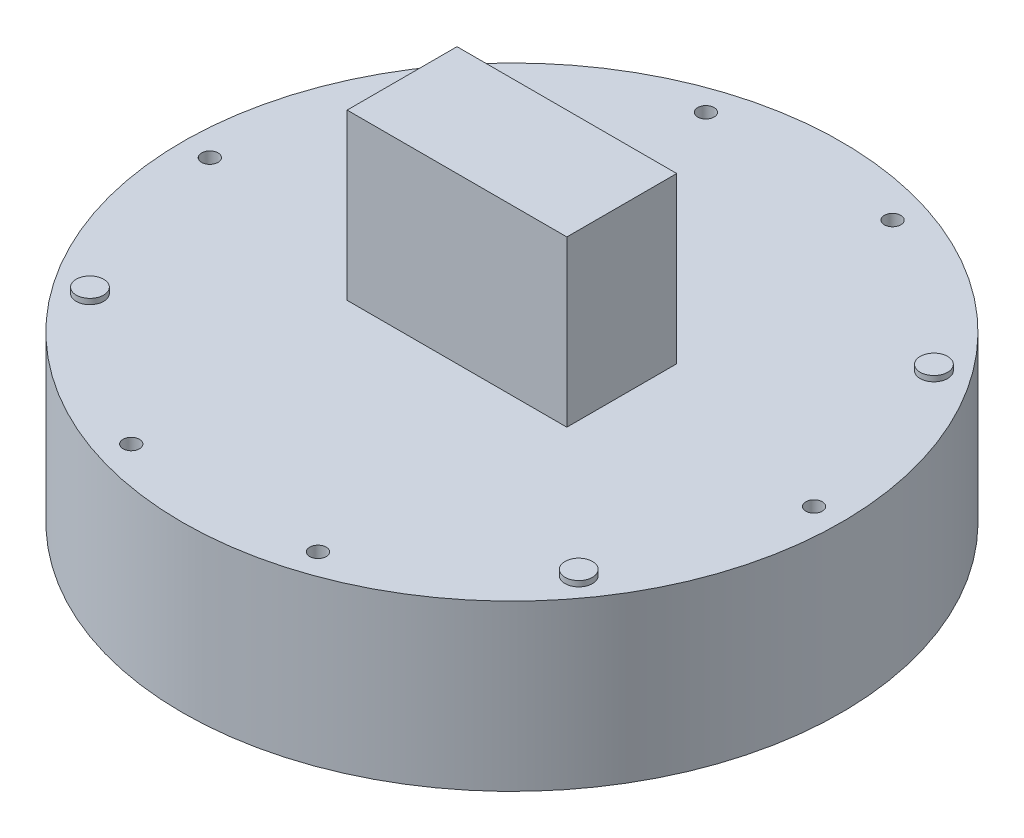
ISO-10303-21;
HEADER;
FILE_DESCRIPTION(('STEP AP214'),'2;1');
FILE_NAME('part.step','',(''),(''),'','','');
FILE_SCHEMA(('AUTOMOTIVE_DESIGN { 1 0 10303 214 1 1 1 1 }'));
ENDSEC;
DATA;
#1=APPLICATION_CONTEXT('core data for automotive mechanical design processes');
#2=APPLICATION_PROTOCOL_DEFINITION('international standard','automotive_design',2000,#1);
#3=PRODUCT_CONTEXT('',#1,'mechanical');
#4=PRODUCT('Part','Part','',(#3));
#5=PRODUCT_RELATED_PRODUCT_CATEGORY('part','',(#4));
#6=PRODUCT_DEFINITION_FORMATION('','',#4);
#7=PRODUCT_DEFINITION_CONTEXT('part definition',#1,'design');
#8=PRODUCT_DEFINITION('design','',#6,#7);
#9=PRODUCT_DEFINITION_SHAPE('','',#8);
#10=(LENGTH_UNIT() NAMED_UNIT(*) SI_UNIT(.MILLI.,.METRE.));
#11=(NAMED_UNIT(*) PLANE_ANGLE_UNIT() SI_UNIT($,.RADIAN.));
#12=(NAMED_UNIT(*) SI_UNIT($,.STERADIAN.) SOLID_ANGLE_UNIT());
#13=UNCERTAINTY_MEASURE_WITH_UNIT(LENGTH_MEASURE(1.E-05),#10,'distance_accuracy_value','');
#14=(GEOMETRIC_REPRESENTATION_CONTEXT(3) GLOBAL_UNCERTAINTY_ASSIGNED_CONTEXT((#13)) GLOBAL_UNIT_ASSIGNED_CONTEXT((#10,
#11,#12)) REPRESENTATION_CONTEXT('',''));
#15=CARTESIAN_POINT('',(0.,0.,0.));
#16=DIRECTION('',(0.,0.,1.));
#17=DIRECTION('',(1.,0.,0.));
#18=AXIS2_PLACEMENT_3D('',#15,#16,#17);
#19=CARTESIAN_POINT('',(0.,30.,0.));
#20=DIRECTION('',(0.,1.,0.));
#21=DIRECTION('',(0.,0.,1.));
#22=AXIS2_PLACEMENT_3D('',#19,#20,#21);
#23=PLANE('',#22);
#24=CARTESIAN_POINT('',(44.4959346906225,30.,32.3281888760854));
#25=DIRECTION('',(0.,1.,0.));
#26=DIRECTION('',(0.,0.,1.));
#27=AXIS2_PLACEMENT_3D('',#24,#25,#26);
#28=CIRCLE('',#27,2.5);
#29=CARTESIAN_POINT('',(44.4959346906225,30.,34.8281888760854));
#30=VERTEX_POINT('',#29);
#31=EDGE_CURVE('E299',#30,#30,#28,.T.);
#32=ORIENTED_EDGE('',*,*,#31,.F.);
#33=EDGE_LOOP('',(#32));
#34=FACE_BOUND('',#33,.T.);
#35=CARTESIAN_POINT('',(-44.4959346906218,30.,32.3281888760864));
#36=DIRECTION('',(0.,1.,0.));
#37=DIRECTION('',(0.,0.,1.));
#38=AXIS2_PLACEMENT_3D('',#35,#36,#37);
#39=CIRCLE('',#38,2.5);
#40=CARTESIAN_POINT('',(-44.4959346906218,30.,34.8281888760864));
#41=VERTEX_POINT('',#40);
#42=EDGE_CURVE('E310',#41,#41,#39,.T.);
#43=ORIENTED_EDGE('',*,*,#42,.F.);
#44=EDGE_LOOP('',(#43));
#45=FACE_BOUND('',#44,.T.);
#46=CARTESIAN_POINT('',(44.4959346906221,30.,-32.3281888760861));
#47=DIRECTION('',(0.,1.,0.));
#48=DIRECTION('',(0.,0.,1.));
#49=AXIS2_PLACEMENT_3D('',#46,#47,#48);
#50=CIRCLE('',#49,2.5);
#51=CARTESIAN_POINT('',(44.4959346906221,30.,-29.8281888760861));
#52=VERTEX_POINT('',#51);
#53=EDGE_CURVE('E319',#52,#52,#50,.T.);
#54=ORIENTED_EDGE('',*,*,#53,.F.);
#55=EDGE_LOOP('',(#54));
#56=FACE_BOUND('',#55,.T.);
#57=CARTESIAN_POINT('',(-44.4959346906223,30.,-32.3281888760858));
#58=DIRECTION('',(0.,1.,0.));
#59=DIRECTION('',(0.,0.,1.));
#60=AXIS2_PLACEMENT_3D('',#57,#58,#59);
#61=CIRCLE('',#60,2.5);
#62=CARTESIAN_POINT('',(-44.4959346906223,30.,-29.8281888760858));
#63=VERTEX_POINT('',#62);
#64=EDGE_CURVE('E328',#63,#63,#61,.T.);
#65=ORIENTED_EDGE('',*,*,#64,.F.);
#66=EDGE_LOOP('',(#65));
#67=FACE_BOUND('',#66,.T.);
#68=CARTESIAN_POINT('',(16.9959346906227,30.,52.3081083962333));
#69=DIRECTION('',(0.,1.,0.));
#70=DIRECTION('',(-0.95105651629515,0.,0.309016994374958));
#71=AXIS2_PLACEMENT_3D('',#68,#69,#70);
#72=CIRCLE('',#71,1.5);
#73=CARTESIAN_POINT('',(15.56934991618,30.,52.7716338877957));
#74=VERTEX_POINT('',#73);
#75=EDGE_CURVE('E149',#74,#74,#72,.T.);
#76=ORIENTED_EDGE('',*,*,#75,.F.);
#77=EDGE_LOOP('',(#76));
#78=FACE_BOUND('',#77,.T.);
#79=CARTESIAN_POINT('',(-16.9959346906216,30.,52.3081083962336));
#80=DIRECTION('',(0.,1.,0.));
#81=DIRECTION('',(-0.951056516295157,0.,-0.309016994374938));
#82=AXIS2_PLACEMENT_3D('',#79,#80,#81);
#83=CIRCLE('',#82,1.5);
#84=CARTESIAN_POINT('',(-18.4225194650643,30.,51.8445829046712));
#85=VERTEX_POINT('',#84);
#86=EDGE_CURVE('E143',#85,#85,#83,.T.);
#87=ORIENTED_EDGE('',*,*,#86,.F.);
#88=EDGE_LOOP('',(#87));
#89=FACE_BOUND('',#88,.T.);
#90=CARTESIAN_POINT('',(-55.,30.,0.));
#91=DIRECTION('',(0.,1.,0.));
#92=DIRECTION('',(0.,0.,-1.));
#93=AXIS2_PLACEMENT_3D('',#90,#91,#92);
#94=CIRCLE('',#93,1.5);
#95=CARTESIAN_POINT('',(-55.,30.,-1.5));
#96=VERTEX_POINT('',#95);
#97=EDGE_CURVE('E134',#96,#96,#94,.T.);
#98=ORIENTED_EDGE('',*,*,#97,.F.);
#99=EDGE_LOOP('',(#98));
#100=FACE_BOUND('',#99,.T.);
#101=CARTESIAN_POINT('',(-16.9959346906223,30.,-52.3081083962334));
#102=DIRECTION('',(0.,1.,0.));
#103=DIRECTION('',(0.951056516295152,0.,-0.309016994374952));
#104=AXIS2_PLACEMENT_3D('',#101,#102,#103);
#105=CIRCLE('',#104,1.5);
#106=CARTESIAN_POINT('',(-15.5693499161796,30.,-52.7716338877958));
#107=VERTEX_POINT('',#106);
#108=EDGE_CURVE('E125',#107,#107,#105,.T.);
#109=ORIENTED_EDGE('',*,*,#108,.F.);
#110=EDGE_LOOP('',(#109));
#111=FACE_BOUND('',#110,.T.);
#112=CARTESIAN_POINT('',(16.995934690622,30.,-52.3081083962335));
#113=DIRECTION('',(0.,1.,0.));
#114=DIRECTION('',(0.951056516295155,0.,0.309016994374945));
#115=AXIS2_PLACEMENT_3D('',#112,#113,#114);
#116=CIRCLE('',#115,1.5);
#117=CARTESIAN_POINT('',(18.4225194650647,30.,-51.8445829046711));
#118=VERTEX_POINT('',#117);
#119=EDGE_CURVE('E119',#118,#118,#116,.T.);
#120=ORIENTED_EDGE('',*,*,#119,.F.);
#121=EDGE_LOOP('',(#120));
#122=FACE_BOUND('',#121,.T.);
#123=CARTESIAN_POINT('',(55.,30.,0.));
#124=DIRECTION('',(0.,1.,0.));
#125=DIRECTION('',(0.,0.,1.));
#126=AXIS2_PLACEMENT_3D('',#123,#124,#125);
#127=CIRCLE('',#126,1.5);
#128=CARTESIAN_POINT('',(55.,30.,1.5));
#129=VERTEX_POINT('',#128);
#130=EDGE_CURVE('E156',#129,#129,#127,.T.);
#131=ORIENTED_EDGE('',*,*,#130,.F.);
#132=EDGE_LOOP('',(#131));
#133=FACE_BOUND('',#132,.T.);
#134=CARTESIAN_POINT('',(0.,30.,0.));
#135=DIRECTION('',(0.,1.,0.));
#136=DIRECTION('',(0.,0.,1.));
#137=AXIS2_PLACEMENT_3D('',#134,#135,#136);
#138=CIRCLE('',#137,60.);
#139=CARTESIAN_POINT('',(0.,30.,60.));
#140=VERTEX_POINT('',#139);
#141=EDGE_CURVE('E11',#140,#140,#138,.T.);
#142=ORIENTED_EDGE('',*,*,#141,.T.);
#143=EDGE_LOOP('',(#142));
#144=FACE_BOUND('',#143,.T.);
#145=DIRECTION('',(-1.,0.,0.));
#146=VECTOR('',#145,1.);
#147=CARTESIAN_POINT('',(-20.,30.,-10.));
#148=LINE('',#147,#146);
#149=CARTESIAN_POINT('',(20.,30.,-10.));
#150=VERTEX_POINT('',#149);
#151=CARTESIAN_POINT('',(-20.,30.,-10.));
#152=VERTEX_POINT('',#151);
#153=EDGE_CURVE('E92',#150,#152,#148,.T.);
#154=ORIENTED_EDGE('',*,*,#153,.F.);
#155=DIRECTION('',(0.,0.,-1.));
#156=VECTOR('',#155,1.);
#157=CARTESIAN_POINT('',(20.,30.,-10.));
#158=LINE('',#157,#156);
#159=CARTESIAN_POINT('',(20.,30.,10.));
#160=VERTEX_POINT('',#159);
#161=EDGE_CURVE('E103',#160,#150,#158,.T.);
#162=ORIENTED_EDGE('',*,*,#161,.F.);
#163=DIRECTION('',(1.,0.,0.));
#164=VECTOR('',#163,1.);
#165=CARTESIAN_POINT('',(-20.,30.,10.));
#166=LINE('',#165,#164);
#167=CARTESIAN_POINT('',(-20.,30.,10.));
#168=VERTEX_POINT('',#167);
#169=EDGE_CURVE('E73',#168,#160,#166,.T.);
#170=ORIENTED_EDGE('',*,*,#169,.F.);
#171=DIRECTION('',(0.,0.,1.));
#172=VECTOR('',#171,1.);
#173=CARTESIAN_POINT('',(-20.,30.,-10.));
#174=LINE('',#173,#172);
#175=EDGE_CURVE('E108',#152,#168,#174,.T.);
#176=ORIENTED_EDGE('',*,*,#175,.F.);
#177=EDGE_LOOP('',(#154,#162,#170,#176));
#178=FACE_BOUND('',#177,.T.);
#179=ADVANCED_FACE('F35',(#34,#45,#56,#67,#78,#89,#100,#111,#122,#133,#144,#178),#23,.T.);
#180=CARTESIAN_POINT('',(0.,30.,0.));
#181=DIRECTION('',(0.,-1.,0.));
#182=DIRECTION('',(0.,0.,-1.));
#183=AXIS2_PLACEMENT_3D('',#180,#181,#182);
#184=CYLINDRICAL_SURFACE('',#183,60.);
#185=ORIENTED_EDGE('',*,*,#141,.F.);
#186=EDGE_LOOP('',(#185));
#187=FACE_BOUND('',#186,.T.);
#188=CARTESIAN_POINT('',(0.,0.,0.));
#189=DIRECTION('',(0.,1.,0.));
#190=DIRECTION('',(0.,0.,1.));
#191=AXIS2_PLACEMENT_3D('',#188,#189,#190);
#192=CIRCLE('',#191,60.);
#193=CARTESIAN_POINT('',(0.,0.,60.));
#194=VERTEX_POINT('',#193);
#195=EDGE_CURVE('E39',#194,#194,#192,.T.);
#196=ORIENTED_EDGE('',*,*,#195,.T.);
#197=EDGE_LOOP('',(#196));
#198=FACE_BOUND('',#197,.T.);
#199=ADVANCED_FACE('F37',(#187,#198),#184,.T.);
#200=CARTESIAN_POINT('',(0.,0.,0.));
#201=DIRECTION('',(0.,1.,0.));
#202=DIRECTION('',(0.,0.,1.));
#203=AXIS2_PLACEMENT_3D('',#200,#201,#202);
#204=PLANE('',#203);
#205=CARTESIAN_POINT('',(0.,0.,0.));
#206=DIRECTION('',(0.,-1.,0.));
#207=DIRECTION('',(0.,0.,-1.));
#208=AXIS2_PLACEMENT_3D('',#205,#206,#207);
#209=CIRCLE('',#208,2.5);
#210=CARTESIAN_POINT('',(0.,0.,-2.5));
#211=VERTEX_POINT('',#210);
#212=EDGE_CURVE('E291',#211,#211,#209,.T.);
#213=ORIENTED_EDGE('',*,*,#212,.F.);
#214=EDGE_LOOP('',(#213));
#215=FACE_BOUND('',#214,.T.);
#216=ORIENTED_EDGE('',*,*,#195,.F.);
#217=EDGE_LOOP('',(#216));
#218=FACE_BOUND('',#217,.T.);
#219=ADVANCED_FACE('F278',(#215,#218),#204,.F.);
#220=CARTESIAN_POINT('',(55.,25.,0.));
#221=DIRECTION('',(0.,1.,0.));
#222=DIRECTION('',(0.,0.,1.));
#223=AXIS2_PLACEMENT_3D('',#220,#221,#222);
#224=CYLINDRICAL_SURFACE('',#223,1.5);
#225=CARTESIAN_POINT('',(55.,25.,0.));
#226=DIRECTION('',(0.,1.,0.));
#227=DIRECTION('',(0.,0.,1.));
#228=AXIS2_PLACEMENT_3D('',#225,#226,#227);
#229=CIRCLE('',#228,1.5);
#230=CARTESIAN_POINT('',(55.,25.,1.5));
#231=VERTEX_POINT('',#230);
#232=EDGE_CURVE('E157',#231,#231,#229,.T.);
#233=ORIENTED_EDGE('',*,*,#232,.F.);
#234=EDGE_LOOP('',(#233));
#235=FACE_BOUND('',#234,.T.);
#236=ORIENTED_EDGE('',*,*,#130,.T.);
#237=EDGE_LOOP('',(#236));
#238=FACE_BOUND('',#237,.T.);
#239=ADVANCED_FACE('F163',(#235,#238),#224,.F.);
#240=CARTESIAN_POINT('',(55.,25.,0.));
#241=DIRECTION('',(0.,1.,0.));
#242=DIRECTION('',(0.,0.,1.));
#243=AXIS2_PLACEMENT_3D('',#240,#241,#242);
#244=PLANE('',#243);
#245=ORIENTED_EDGE('',*,*,#232,.T.);
#246=EDGE_LOOP('',(#245));
#247=FACE_BOUND('',#246,.T.);
#248=ADVANCED_FACE('F199',(#247),#244,.T.);
#249=CARTESIAN_POINT('',(16.995934690622,25.,-52.3081083962335));
#250=DIRECTION('',(0.,1.,0.));
#251=DIRECTION('',(0.,0.,1.));
#252=AXIS2_PLACEMENT_3D('',#249,#250,#251);
#253=CYLINDRICAL_SURFACE('',#252,1.5);
#254=CARTESIAN_POINT('',(16.995934690622,25.,-52.3081083962335));
#255=DIRECTION('',(0.,1.,0.));
#256=DIRECTION('',(0.951056516295155,0.,0.309016994374945));
#257=AXIS2_PLACEMENT_3D('',#254,#255,#256);
#258=CIRCLE('',#257,1.5);
#259=CARTESIAN_POINT('',(18.4225194650647,25.,-51.8445829046711));
#260=VERTEX_POINT('',#259);
#261=EDGE_CURVE('E115',#260,#260,#258,.T.);
#262=ORIENTED_EDGE('',*,*,#261,.F.);
#263=EDGE_LOOP('',(#262));
#264=FACE_BOUND('',#263,.T.);
#265=ORIENTED_EDGE('',*,*,#119,.T.);
#266=EDGE_LOOP('',(#265));
#267=FACE_BOUND('',#266,.T.);
#268=ADVANCED_FACE('F195',(#264,#267),#253,.F.);
#269=CARTESIAN_POINT('',(16.995934690622,25.,-52.3081083962335));
#270=DIRECTION('',(0.,1.,0.));
#271=DIRECTION('',(0.951056516295155,0.,0.309016994374945));
#272=AXIS2_PLACEMENT_3D('',#269,#270,#271);
#273=PLANE('',#272);
#274=ORIENTED_EDGE('',*,*,#261,.T.);
#275=EDGE_LOOP('',(#274));
#276=FACE_BOUND('',#275,.T.);
#277=ADVANCED_FACE('F191',(#276),#273,.T.);
#278=CARTESIAN_POINT('',(-16.9959346906223,25.,-52.3081083962334));
#279=DIRECTION('',(0.,1.,0.));
#280=DIRECTION('',(0.,0.,1.));
#281=AXIS2_PLACEMENT_3D('',#278,#279,#280);
#282=CYLINDRICAL_SURFACE('',#281,1.5);
#283=CARTESIAN_POINT('',(-16.9959346906223,25.,-52.3081083962334));
#284=DIRECTION('',(0.,1.,0.));
#285=DIRECTION('',(0.951056516295152,0.,-0.309016994374952));
#286=AXIS2_PLACEMENT_3D('',#283,#284,#285);
#287=CIRCLE('',#286,1.5);
#288=CARTESIAN_POINT('',(-15.5693499161796,25.,-52.7716338877958));
#289=VERTEX_POINT('',#288);
#290=EDGE_CURVE('E122',#289,#289,#287,.T.);
#291=ORIENTED_EDGE('',*,*,#290,.F.);
#292=EDGE_LOOP('',(#291));
#293=FACE_BOUND('',#292,.T.);
#294=ORIENTED_EDGE('',*,*,#108,.T.);
#295=EDGE_LOOP('',(#294));
#296=FACE_BOUND('',#295,.T.);
#297=ADVANCED_FACE('F194',(#293,#296),#282,.F.);
#298=CARTESIAN_POINT('',(-16.9959346906223,25.,-52.3081083962334));
#299=DIRECTION('',(0.,1.,0.));
#300=DIRECTION('',(0.951056516295152,0.,-0.309016994374952));
#301=AXIS2_PLACEMENT_3D('',#298,#299,#300);
#302=PLANE('',#301);
#303=ORIENTED_EDGE('',*,*,#290,.T.);
#304=EDGE_LOOP('',(#303));
#305=FACE_BOUND('',#304,.T.);
#306=ADVANCED_FACE('F201',(#305),#302,.T.);
#307=CARTESIAN_POINT('',(-55.,25.,0.));
#308=DIRECTION('',(0.,1.,0.));
#309=DIRECTION('',(0.,0.,1.));
#310=AXIS2_PLACEMENT_3D('',#307,#308,#309);
#311=CYLINDRICAL_SURFACE('',#310,1.5);
#312=CARTESIAN_POINT('',(-55.,25.,0.));
#313=DIRECTION('',(0.,1.,0.));
#314=DIRECTION('',(0.,0.,-1.));
#315=AXIS2_PLACEMENT_3D('',#312,#313,#314);
#316=CIRCLE('',#315,1.5);
#317=CARTESIAN_POINT('',(-55.,25.,-1.5));
#318=VERTEX_POINT('',#317);
#319=EDGE_CURVE('E131',#318,#318,#316,.T.);
#320=ORIENTED_EDGE('',*,*,#319,.F.);
#321=EDGE_LOOP('',(#320));
#322=FACE_BOUND('',#321,.T.);
#323=ORIENTED_EDGE('',*,*,#97,.T.);
#324=EDGE_LOOP('',(#323));
#325=FACE_BOUND('',#324,.T.);
#326=ADVANCED_FACE('F204',(#322,#325),#311,.F.);
#327=CARTESIAN_POINT('',(-55.,25.,0.));
#328=DIRECTION('',(0.,1.,0.));
#329=DIRECTION('',(0.,0.,-1.));
#330=AXIS2_PLACEMENT_3D('',#327,#328,#329);
#331=PLANE('',#330);
#332=ORIENTED_EDGE('',*,*,#319,.T.);
#333=EDGE_LOOP('',(#332));
#334=FACE_BOUND('',#333,.T.);
#335=ADVANCED_FACE('F220',(#334),#331,.T.);
#336=CARTESIAN_POINT('',(-16.9959346906216,25.,52.3081083962336));
#337=DIRECTION('',(0.,1.,0.));
#338=DIRECTION('',(0.,0.,1.));
#339=AXIS2_PLACEMENT_3D('',#336,#337,#338);
#340=CYLINDRICAL_SURFACE('',#339,1.5);
#341=CARTESIAN_POINT('',(-16.9959346906216,25.,52.3081083962336));
#342=DIRECTION('',(0.,1.,0.));
#343=DIRECTION('',(-0.951056516295157,0.,-0.309016994374938));
#344=AXIS2_PLACEMENT_3D('',#341,#342,#343);
#345=CIRCLE('',#344,1.5);
#346=CARTESIAN_POINT('',(-18.4225194650643,25.,51.8445829046712));
#347=VERTEX_POINT('',#346);
#348=EDGE_CURVE('E140',#347,#347,#345,.T.);
#349=ORIENTED_EDGE('',*,*,#348,.F.);
#350=EDGE_LOOP('',(#349));
#351=FACE_BOUND('',#350,.T.);
#352=ORIENTED_EDGE('',*,*,#86,.T.);
#353=EDGE_LOOP('',(#352));
#354=FACE_BOUND('',#353,.T.);
#355=ADVANCED_FACE('F223',(#351,#354),#340,.F.);
#356=CARTESIAN_POINT('',(-16.9959346906216,25.,52.3081083962336));
#357=DIRECTION('',(0.,1.,0.));
#358=DIRECTION('',(-0.951056516295157,0.,-0.309016994374938));
#359=AXIS2_PLACEMENT_3D('',#356,#357,#358);
#360=PLANE('',#359);
#361=ORIENTED_EDGE('',*,*,#348,.T.);
#362=EDGE_LOOP('',(#361));
#363=FACE_BOUND('',#362,.T.);
#364=ADVANCED_FACE('F239',(#363),#360,.T.);
#365=CARTESIAN_POINT('',(16.9959346906227,25.,52.3081083962333));
#366=DIRECTION('',(0.,1.,0.));
#367=DIRECTION('',(0.,0.,1.));
#368=AXIS2_PLACEMENT_3D('',#365,#366,#367);
#369=CYLINDRICAL_SURFACE('',#368,1.5);
#370=CARTESIAN_POINT('',(16.9959346906227,25.,52.3081083962333));
#371=DIRECTION('',(0.,1.,0.));
#372=DIRECTION('',(-0.95105651629515,0.,0.309016994374958));
#373=AXIS2_PLACEMENT_3D('',#370,#371,#372);
#374=CIRCLE('',#373,1.5);
#375=CARTESIAN_POINT('',(15.56934991618,25.,52.7716338877957));
#376=VERTEX_POINT('',#375);
#377=EDGE_CURVE('E146',#376,#376,#374,.T.);
#378=ORIENTED_EDGE('',*,*,#377,.F.);
#379=EDGE_LOOP('',(#378));
#380=FACE_BOUND('',#379,.T.);
#381=ORIENTED_EDGE('',*,*,#75,.T.);
#382=EDGE_LOOP('',(#381));
#383=FACE_BOUND('',#382,.T.);
#384=ADVANCED_FACE('F242',(#380,#383),#369,.F.);
#385=CARTESIAN_POINT('',(16.9959346906227,25.,52.3081083962333));
#386=DIRECTION('',(0.,1.,0.));
#387=DIRECTION('',(-0.95105651629515,0.,0.309016994374958));
#388=AXIS2_PLACEMENT_3D('',#385,#386,#387);
#389=PLANE('',#388);
#390=ORIENTED_EDGE('',*,*,#377,.T.);
#391=EDGE_LOOP('',(#390));
#392=FACE_BOUND('',#391,.T.);
#393=ADVANCED_FACE('F190',(#392),#389,.T.);
#394=CARTESIAN_POINT('',(20.,60.,-10.));
#395=DIRECTION('',(-1.,0.,0.));
#396=DIRECTION('',(0.,0.,1.));
#397=AXIS2_PLACEMENT_3D('',#394,#395,#396);
#398=PLANE('',#397);
#399=ORIENTED_EDGE('',*,*,#161,.T.);
#400=DIRECTION('',(0.,-1.,0.));
#401=VECTOR('',#400,1.);
#402=CARTESIAN_POINT('',(20.,60.,-10.));
#403=LINE('',#402,#401);
#404=CARTESIAN_POINT('',(20.,60.,-10.));
#405=VERTEX_POINT('',#404);
#406=EDGE_CURVE('E95',#405,#150,#403,.T.);
#407=ORIENTED_EDGE('',*,*,#406,.F.);
#408=DIRECTION('',(0.,0.,-1.));
#409=VECTOR('',#408,1.);
#410=CARTESIAN_POINT('',(20.,60.,-10.));
#411=LINE('',#410,#409);
#412=CARTESIAN_POINT('',(20.,60.,10.));
#413=VERTEX_POINT('',#412);
#414=EDGE_CURVE('E85',#413,#405,#411,.T.);
#415=ORIENTED_EDGE('',*,*,#414,.F.);
#416=DIRECTION('',(0.,-1.,0.));
#417=VECTOR('',#416,1.);
#418=CARTESIAN_POINT('',(20.,60.,10.));
#419=LINE('',#418,#417);
#420=EDGE_CURVE('E99',#413,#160,#419,.T.);
#421=ORIENTED_EDGE('',*,*,#420,.T.);
#422=EDGE_LOOP('',(#399,#407,#415,#421));
#423=FACE_BOUND('',#422,.T.);
#424=ADVANCED_FACE('F173',(#423),#398,.F.);
#425=CARTESIAN_POINT('',(-20.,60.,-10.));
#426=DIRECTION('',(0.,0.,1.));
#427=DIRECTION('',(1.,0.,0.));
#428=AXIS2_PLACEMENT_3D('',#425,#426,#427);
#429=PLANE('',#428);
#430=ORIENTED_EDGE('',*,*,#153,.T.);
#431=DIRECTION('',(0.,-1.,0.));
#432=VECTOR('',#431,1.);
#433=CARTESIAN_POINT('',(-20.,60.,-10.));
#434=LINE('',#433,#432);
#435=CARTESIAN_POINT('',(-20.,60.,-10.));
#436=VERTEX_POINT('',#435);
#437=EDGE_CURVE('E89',#436,#152,#434,.T.);
#438=ORIENTED_EDGE('',*,*,#437,.F.);
#439=DIRECTION('',(-1.,0.,0.));
#440=VECTOR('',#439,1.);
#441=CARTESIAN_POINT('',(-20.,60.,-10.));
#442=LINE('',#441,#440);
#443=EDGE_CURVE('E80',#405,#436,#442,.T.);
#444=ORIENTED_EDGE('',*,*,#443,.F.);
#445=ORIENTED_EDGE('',*,*,#406,.T.);
#446=EDGE_LOOP('',(#430,#438,#444,#445));
#447=FACE_BOUND('',#446,.T.);
#448=ADVANCED_FACE('F90',(#447),#429,.F.);
#449=CARTESIAN_POINT('',(-20.,60.,-10.));
#450=DIRECTION('',(1.,0.,0.));
#451=DIRECTION('',(0.,0.,-1.));
#452=AXIS2_PLACEMENT_3D('',#449,#450,#451);
#453=PLANE('',#452);
#454=ORIENTED_EDGE('',*,*,#175,.T.);
#455=DIRECTION('',(0.,-1.,0.));
#456=VECTOR('',#455,1.);
#457=CARTESIAN_POINT('',(-20.,60.,10.));
#458=LINE('',#457,#456);
#459=CARTESIAN_POINT('',(-20.,60.,10.));
#460=VERTEX_POINT('',#459);
#461=EDGE_CURVE('E51',#460,#168,#458,.T.);
#462=ORIENTED_EDGE('',*,*,#461,.F.);
#463=DIRECTION('',(0.,0.,1.));
#464=VECTOR('',#463,1.);
#465=CARTESIAN_POINT('',(-20.,60.,-10.));
#466=LINE('',#465,#464);
#467=EDGE_CURVE('E83',#436,#460,#466,.T.);
#468=ORIENTED_EDGE('',*,*,#467,.F.);
#469=ORIENTED_EDGE('',*,*,#437,.T.);
#470=EDGE_LOOP('',(#454,#462,#468,#469));
#471=FACE_BOUND('',#470,.T.);
#472=ADVANCED_FACE('F97',(#471),#453,.F.);
#473=CARTESIAN_POINT('',(-20.,60.,10.));
#474=DIRECTION('',(0.,0.,-1.));
#475=DIRECTION('',(-1.,0.,0.));
#476=AXIS2_PLACEMENT_3D('',#473,#474,#475);
#477=PLANE('',#476);
#478=ORIENTED_EDGE('',*,*,#169,.T.);
#479=ORIENTED_EDGE('',*,*,#420,.F.);
#480=DIRECTION('',(1.,0.,0.));
#481=VECTOR('',#480,1.);
#482=CARTESIAN_POINT('',(-20.,60.,10.));
#483=LINE('',#482,#481);
#484=EDGE_CURVE('E59',#460,#413,#483,.T.);
#485=ORIENTED_EDGE('',*,*,#484,.F.);
#486=ORIENTED_EDGE('',*,*,#461,.T.);
#487=EDGE_LOOP('',(#478,#479,#485,#486));
#488=FACE_BOUND('',#487,.T.);
#489=ADVANCED_FACE('F174',(#488),#477,.F.);
#490=CARTESIAN_POINT('',(0.,60.,0.));
#491=DIRECTION('',(0.,1.,0.));
#492=DIRECTION('',(0.,0.,1.));
#493=AXIS2_PLACEMENT_3D('',#490,#491,#492);
#494=PLANE('',#493);
#495=ORIENTED_EDGE('',*,*,#414,.T.);
#496=ORIENTED_EDGE('',*,*,#443,.T.);
#497=ORIENTED_EDGE('',*,*,#467,.T.);
#498=ORIENTED_EDGE('',*,*,#484,.T.);
#499=EDGE_LOOP('',(#495,#496,#497,#498));
#500=FACE_BOUND('',#499,.T.);
#501=ADVANCED_FACE('F81',(#500),#494,.T.);
#502=CARTESIAN_POINT('',(-44.4959346906223,31.,-32.3281888760858));
#503=DIRECTION('',(0.,-1.,0.));
#504=DIRECTION('',(0.,0.,-1.));
#505=AXIS2_PLACEMENT_3D('',#502,#503,#504);
#506=CYLINDRICAL_SURFACE('',#505,2.5);
#507=CARTESIAN_POINT('',(-44.4959346906223,31.,-32.3281888760858));
#508=DIRECTION('',(0.,1.,0.));
#509=DIRECTION('',(0.,0.,1.));
#510=AXIS2_PLACEMENT_3D('',#507,#508,#509);
#511=CIRCLE('',#510,2.5);
#512=CARTESIAN_POINT('',(-44.4959346906223,31.,-29.8281888760858));
#513=VERTEX_POINT('',#512);
#514=EDGE_CURVE('E329',#513,#513,#511,.T.);
#515=ORIENTED_EDGE('',*,*,#514,.F.);
#516=EDGE_LOOP('',(#515));
#517=FACE_BOUND('',#516,.T.);
#518=ORIENTED_EDGE('',*,*,#64,.T.);
#519=EDGE_LOOP('',(#518));
#520=FACE_BOUND('',#519,.T.);
#521=ADVANCED_FACE('F181',(#517,#520),#506,.T.);
#522=CARTESIAN_POINT('',(-44.4959346906223,31.,-32.3281888760858));
#523=DIRECTION('',(0.,1.,0.));
#524=DIRECTION('',(0.,0.,1.));
#525=AXIS2_PLACEMENT_3D('',#522,#523,#524);
#526=PLANE('',#525);
#527=ORIENTED_EDGE('',*,*,#514,.T.);
#528=EDGE_LOOP('',(#527));
#529=FACE_BOUND('',#528,.T.);
#530=ADVANCED_FACE('F346',(#529),#526,.T.);
#531=CARTESIAN_POINT('',(44.4959346906221,31.,-32.3281888760861));
#532=DIRECTION('',(0.,-1.,0.));
#533=DIRECTION('',(0.,0.,-1.));
#534=AXIS2_PLACEMENT_3D('',#531,#532,#533);
#535=CYLINDRICAL_SURFACE('',#534,2.5);
#536=CARTESIAN_POINT('',(44.4959346906221,31.,-32.3281888760861));
#537=DIRECTION('',(0.,1.,0.));
#538=DIRECTION('',(0.,0.,1.));
#539=AXIS2_PLACEMENT_3D('',#536,#537,#538);
#540=CIRCLE('',#539,2.5);
#541=CARTESIAN_POINT('',(44.4959346906221,31.,-29.8281888760861));
#542=VERTEX_POINT('',#541);
#543=EDGE_CURVE('E320',#542,#542,#540,.T.);
#544=ORIENTED_EDGE('',*,*,#543,.F.);
#545=EDGE_LOOP('',(#544));
#546=FACE_BOUND('',#545,.T.);
#547=ORIENTED_EDGE('',*,*,#53,.T.);
#548=EDGE_LOOP('',(#547));
#549=FACE_BOUND('',#548,.T.);
#550=ADVANCED_FACE('F353',(#546,#549),#535,.T.);
#551=CARTESIAN_POINT('',(44.4959346906221,31.,-32.3281888760861));
#552=DIRECTION('',(0.,1.,0.));
#553=DIRECTION('',(0.,0.,1.));
#554=AXIS2_PLACEMENT_3D('',#551,#552,#553);
#555=PLANE('',#554);
#556=ORIENTED_EDGE('',*,*,#543,.T.);
#557=EDGE_LOOP('',(#556));
#558=FACE_BOUND('',#557,.T.);
#559=ADVANCED_FACE('F377',(#558),#555,.T.);
#560=CARTESIAN_POINT('',(-44.4959346906218,31.,32.3281888760864));
#561=DIRECTION('',(0.,-1.,0.));
#562=DIRECTION('',(0.,0.,-1.));
#563=AXIS2_PLACEMENT_3D('',#560,#561,#562);
#564=CYLINDRICAL_SURFACE('',#563,2.5);
#565=CARTESIAN_POINT('',(-44.4959346906218,31.,32.3281888760864));
#566=DIRECTION('',(0.,1.,0.));
#567=DIRECTION('',(0.,0.,1.));
#568=AXIS2_PLACEMENT_3D('',#565,#566,#567);
#569=CIRCLE('',#568,2.5);
#570=CARTESIAN_POINT('',(-44.4959346906218,31.,34.8281888760864));
#571=VERTEX_POINT('',#570);
#572=EDGE_CURVE('E311',#571,#571,#569,.T.);
#573=ORIENTED_EDGE('',*,*,#572,.F.);
#574=EDGE_LOOP('',(#573));
#575=FACE_BOUND('',#574,.T.);
#576=ORIENTED_EDGE('',*,*,#42,.T.);
#577=EDGE_LOOP('',(#576));
#578=FACE_BOUND('',#577,.T.);
#579=ADVANCED_FACE('F382',(#575,#578),#564,.T.);
#580=CARTESIAN_POINT('',(-44.4959346906218,31.,32.3281888760864));
#581=DIRECTION('',(0.,1.,0.));
#582=DIRECTION('',(0.,0.,1.));
#583=AXIS2_PLACEMENT_3D('',#580,#581,#582);
#584=PLANE('',#583);
#585=ORIENTED_EDGE('',*,*,#572,.T.);
#586=EDGE_LOOP('',(#585));
#587=FACE_BOUND('',#586,.T.);
#588=ADVANCED_FACE('F393',(#587),#584,.T.);
#589=CARTESIAN_POINT('',(44.4959346906225,31.,32.3281888760854));
#590=DIRECTION('',(0.,-1.,0.));
#591=DIRECTION('',(0.,0.,-1.));
#592=AXIS2_PLACEMENT_3D('',#589,#590,#591);
#593=CYLINDRICAL_SURFACE('',#592,2.5);
#594=CARTESIAN_POINT('',(44.4959346906225,31.,32.3281888760854));
#595=DIRECTION('',(0.,1.,0.));
#596=DIRECTION('',(0.,0.,1.));
#597=AXIS2_PLACEMENT_3D('',#594,#595,#596);
#598=CIRCLE('',#597,2.5);
#599=CARTESIAN_POINT('',(44.4959346906225,31.,34.8281888760854));
#600=VERTEX_POINT('',#599);
#601=EDGE_CURVE('E302',#600,#600,#598,.T.);
#602=ORIENTED_EDGE('',*,*,#601,.F.);
#603=EDGE_LOOP('',(#602));
#604=FACE_BOUND('',#603,.T.);
#605=ORIENTED_EDGE('',*,*,#31,.T.);
#606=EDGE_LOOP('',(#605));
#607=FACE_BOUND('',#606,.T.);
#608=ADVANCED_FACE('F400',(#604,#607),#593,.T.);
#609=CARTESIAN_POINT('',(44.4959346906225,31.,32.3281888760854));
#610=DIRECTION('',(0.,1.,0.));
#611=DIRECTION('',(0.,0.,1.));
#612=AXIS2_PLACEMENT_3D('',#609,#610,#611);
#613=PLANE('',#612);
#614=ORIENTED_EDGE('',*,*,#601,.T.);
#615=EDGE_LOOP('',(#614));
#616=FACE_BOUND('',#615,.T.);
#617=ADVANCED_FACE('F404',(#616),#613,.T.);
#618=CARTESIAN_POINT('',(0.,1.,0.));
#619=DIRECTION('',(0.,-1.,0.));
#620=DIRECTION('',(0.,0.,-1.));
#621=AXIS2_PLACEMENT_3D('',#618,#619,#620);
#622=CYLINDRICAL_SURFACE('',#621,2.5);
#623=CARTESIAN_POINT('',(0.,1.,0.));
#624=DIRECTION('',(0.,-1.,0.));
#625=DIRECTION('',(0.,0.,-1.));
#626=AXIS2_PLACEMENT_3D('',#623,#624,#625);
#627=CIRCLE('',#626,2.5);
#628=CARTESIAN_POINT('',(0.,1.,-2.5));
#629=VERTEX_POINT('',#628);
#630=EDGE_CURVE('E296',#629,#629,#627,.T.);
#631=ORIENTED_EDGE('',*,*,#630,.F.);
#632=EDGE_LOOP('',(#631));
#633=FACE_BOUND('',#632,.T.);
#634=ORIENTED_EDGE('',*,*,#212,.T.);
#635=EDGE_LOOP('',(#634));
#636=FACE_BOUND('',#635,.T.);
#637=ADVANCED_FACE('F411',(#633,#636),#622,.F.);
#638=CARTESIAN_POINT('',(0.,1.,0.));
#639=DIRECTION('',(0.,-1.,0.));
#640=DIRECTION('',(0.,0.,-1.));
#641=AXIS2_PLACEMENT_3D('',#638,#639,#640);
#642=PLANE('',#641);
#643=ORIENTED_EDGE('',*,*,#630,.T.);
#644=EDGE_LOOP('',(#643));
#645=FACE_BOUND('',#644,.T.);
#646=ADVANCED_FACE('F414',(#645),#642,.T.);
#647=CLOSED_SHELL('',(#179,#199,#219,#239,#248,#268,#277,#297,#306,#326,#335,#355,#364,#384,
#393,#424,#448,#472,#489,#501,#521,#530,#550,#559,#579,#588,#608,#617,#637,#646));
#648=CARTESIAN_POINT('',(44.4959346906225,25.,32.3281888760854));
#649=DIRECTION('',(0.,1.,0.));
#650=DIRECTION('',(-0.587785252292462,0.,0.809016994374955));
#651=AXIS2_PLACEMENT_3D('',#648,#649,#650);
#652=PLANE('',#651);
#653=CARTESIAN_POINT('',(44.4959346906225,25.,32.3281888760854));
#654=DIRECTION('',(0.,1.,0.));
#655=DIRECTION('',(-0.587785252292462,0.,0.809016994374955));
#656=AXIS2_PLACEMENT_3D('',#653,#654,#655);
#657=CIRCLE('',#656,1.5);
#658=CARTESIAN_POINT('',(43.6142568121838,25.,33.5417143676479));
#659=VERTEX_POINT('',#658);
#660=EDGE_CURVE('E114',#659,#659,#657,.T.);
#661=ORIENTED_EDGE('',*,*,#660,.T.);
#662=EDGE_LOOP('',(#661));
#663=FACE_BOUND('',#662,.T.);
#664=ADVANCED_FACE('F253',(#663),#652,.T.);
#665=CARTESIAN_POINT('',(44.4959346906225,25.,32.3281888760854));
#666=DIRECTION('',(0.,1.,0.));
#667=DIRECTION('',(0.,0.,1.));
#668=AXIS2_PLACEMENT_3D('',#665,#666,#667);
#669=CYLINDRICAL_SURFACE('',#668,1.5);
#670=ORIENTED_EDGE('',*,*,#660,.F.);
#671=EDGE_LOOP('',(#670));
#672=FACE_BOUND('',#671,.T.);
#673=CARTESIAN_POINT('',(44.4959346906225,30.,32.3281888760854));
#674=DIRECTION('',(0.,1.,0.));
#675=DIRECTION('',(0.,0.,1.));
#676=AXIS2_PLACEMENT_3D('',#673,#674,#675);
#677=CIRCLE('',#676,1.5);
#678=CARTESIAN_POINT('',(44.4959346906225,30.,33.8281888760854));
#679=VERTEX_POINT('',#678);
#680=EDGE_CURVE('E305',#679,#679,#677,.F.);
#681=ORIENTED_EDGE('',*,*,#680,.F.);
#682=EDGE_LOOP('',(#681));
#683=FACE_BOUND('',#682,.T.);
#684=ADVANCED_FACE('F256',(#672,#683),#669,.F.);
#685=CARTESIAN_POINT('',(44.4959346906225,30.,32.3281888760854));
#686=DIRECTION('',(0.,1.,0.));
#687=DIRECTION('',(0.,0.,1.));
#688=AXIS2_PLACEMENT_3D('',#685,#686,#687);
#689=PLANE('',#688);
#690=ORIENTED_EDGE('',*,*,#680,.T.);
#691=EDGE_LOOP('',(#690));
#692=FACE_BOUND('',#691,.T.);
#693=ADVANCED_FACE('F261',(#692),#689,.F.);
#694=CLOSED_SHELL('',(#664,#684,#693));
#695=CARTESIAN_POINT('',(-44.4959346906218,25.,32.3281888760864));
#696=DIRECTION('',(0.,1.,0.));
#697=DIRECTION('',(-0.58778525229248,0.,-0.809016994374942));
#698=AXIS2_PLACEMENT_3D('',#695,#696,#697);
#699=PLANE('',#698);
#700=CARTESIAN_POINT('',(-44.4959346906218,25.,32.3281888760864));
#701=DIRECTION('',(0.,1.,0.));
#702=DIRECTION('',(-0.58778525229248,0.,-0.809016994374942));
#703=AXIS2_PLACEMENT_3D('',#700,#701,#702);
#704=CIRCLE('',#703,1.5);
#705=CARTESIAN_POINT('',(-45.3776125690605,25.,31.114663384524));
#706=VERTEX_POINT('',#705);
#707=EDGE_CURVE('E137',#706,#706,#704,.T.);
#708=ORIENTED_EDGE('',*,*,#707,.T.);
#709=EDGE_LOOP('',(#708));
#710=FACE_BOUND('',#709,.T.);
#711=ADVANCED_FACE('F228',(#710),#699,.T.);
#712=CARTESIAN_POINT('',(-44.4959346906218,25.,32.3281888760864));
#713=DIRECTION('',(0.,1.,0.));
#714=DIRECTION('',(0.,0.,1.));
#715=AXIS2_PLACEMENT_3D('',#712,#713,#714);
#716=CYLINDRICAL_SURFACE('',#715,1.5);
#717=ORIENTED_EDGE('',*,*,#707,.F.);
#718=EDGE_LOOP('',(#717));
#719=FACE_BOUND('',#718,.T.);
#720=CARTESIAN_POINT('',(-44.4959346906218,30.,32.3281888760864));
#721=DIRECTION('',(0.,1.,0.));
#722=DIRECTION('',(0.,0.,1.));
#723=AXIS2_PLACEMENT_3D('',#720,#721,#722);
#724=CIRCLE('',#723,1.5);
#725=CARTESIAN_POINT('',(-44.4959346906218,30.,33.8281888760864));
#726=VERTEX_POINT('',#725);
#727=EDGE_CURVE('E314',#726,#726,#724,.F.);
#728=ORIENTED_EDGE('',*,*,#727,.F.);
#729=EDGE_LOOP('',(#728));
#730=FACE_BOUND('',#729,.T.);
#731=ADVANCED_FACE('F231',(#719,#730),#716,.F.);
#732=CARTESIAN_POINT('',(-44.4959346906218,30.,32.3281888760864));
#733=DIRECTION('',(0.,1.,0.));
#734=DIRECTION('',(0.,0.,1.));
#735=AXIS2_PLACEMENT_3D('',#732,#733,#734);
#736=PLANE('',#735);
#737=ORIENTED_EDGE('',*,*,#727,.T.);
#738=EDGE_LOOP('',(#737));
#739=FACE_BOUND('',#738,.T.);
#740=ADVANCED_FACE('F237',(#739),#736,.F.);
#741=CLOSED_SHELL('',(#711,#731,#740));
#742=CARTESIAN_POINT('',(44.4959346906221,25.,-32.3281888760861));
#743=DIRECTION('',(0.,1.,0.));
#744=DIRECTION('',(0.587785252292474,0.,0.809016994374947));
#745=AXIS2_PLACEMENT_3D('',#742,#743,#744);
#746=PLANE('',#745);
#747=CARTESIAN_POINT('',(44.4959346906221,25.,-32.3281888760861));
#748=DIRECTION('',(0.,1.,0.));
#749=DIRECTION('',(0.587785252292474,0.,0.809016994374947));
#750=AXIS2_PLACEMENT_3D('',#747,#748,#749);
#751=CIRCLE('',#750,1.5);
#752=CARTESIAN_POINT('',(45.3776125690608,25.,-31.1146633845237));
#753=VERTEX_POINT('',#752);
#754=EDGE_CURVE('E118',#753,#753,#751,.T.);
#755=ORIENTED_EDGE('',*,*,#754,.T.);
#756=EDGE_LOOP('',(#755));
#757=FACE_BOUND('',#756,.T.);
#758=ADVANCED_FACE('F263',(#757),#746,.T.);
#759=CARTESIAN_POINT('',(44.4959346906221,25.,-32.3281888760861));
#760=DIRECTION('',(0.,1.,0.));
#761=DIRECTION('',(0.,0.,1.));
#762=AXIS2_PLACEMENT_3D('',#759,#760,#761);
#763=CYLINDRICAL_SURFACE('',#762,1.5);
#764=ORIENTED_EDGE('',*,*,#754,.F.);
#765=EDGE_LOOP('',(#764));
#766=FACE_BOUND('',#765,.T.);
#767=CARTESIAN_POINT('',(44.4959346906221,30.,-32.3281888760861));
#768=DIRECTION('',(0.,1.,0.));
#769=DIRECTION('',(0.,0.,1.));
#770=AXIS2_PLACEMENT_3D('',#767,#768,#769);
#771=CIRCLE('',#770,1.5);
#772=CARTESIAN_POINT('',(44.4959346906221,30.,-30.8281888760861));
#773=VERTEX_POINT('',#772);
#774=EDGE_CURVE('E323',#773,#773,#771,.F.);
#775=ORIENTED_EDGE('',*,*,#774,.F.);
#776=EDGE_LOOP('',(#775));
#777=FACE_BOUND('',#776,.T.);
#778=ADVANCED_FACE('F266',(#766,#777),#763,.F.);
#779=CARTESIAN_POINT('',(44.4959346906221,30.,-32.3281888760861));
#780=DIRECTION('',(0.,1.,0.));
#781=DIRECTION('',(0.,0.,1.));
#782=AXIS2_PLACEMENT_3D('',#779,#780,#781);
#783=PLANE('',#782);
#784=ORIENTED_EDGE('',*,*,#774,.T.);
#785=EDGE_LOOP('',(#784));
#786=FACE_BOUND('',#785,.T.);
#787=ADVANCED_FACE('F272',(#786),#783,.F.);
#788=CLOSED_SHELL('',(#758,#778,#787));
#789=CARTESIAN_POINT('',(-44.4959346906223,25.,-32.3281888760858));
#790=DIRECTION('',(0.,1.,0.));
#791=DIRECTION('',(0.587785252292469,0.,-0.809016994374951));
#792=AXIS2_PLACEMENT_3D('',#789,#790,#791);
#793=PLANE('',#792);
#794=CARTESIAN_POINT('',(-44.4959346906223,25.,-32.3281888760858));
#795=DIRECTION('',(0.,1.,0.));
#796=DIRECTION('',(0.587785252292469,0.,-0.809016994374951));
#797=AXIS2_PLACEMENT_3D('',#794,#795,#796);
#798=CIRCLE('',#797,1.5);
#799=CARTESIAN_POINT('',(-43.6142568121836,25.,-33.5417143676482));
#800=VERTEX_POINT('',#799);
#801=EDGE_CURVE('E128',#800,#800,#798,.T.);
#802=ORIENTED_EDGE('',*,*,#801,.T.);
#803=EDGE_LOOP('',(#802));
#804=FACE_BOUND('',#803,.T.);
#805=ADVANCED_FACE('F209',(#804),#793,.T.);
#806=CARTESIAN_POINT('',(-44.4959346906223,25.,-32.3281888760858));
#807=DIRECTION('',(0.,1.,0.));
#808=DIRECTION('',(0.,0.,1.));
#809=AXIS2_PLACEMENT_3D('',#806,#807,#808);
#810=CYLINDRICAL_SURFACE('',#809,1.5);
#811=ORIENTED_EDGE('',*,*,#801,.F.);
#812=EDGE_LOOP('',(#811));
#813=FACE_BOUND('',#812,.T.);
#814=CARTESIAN_POINT('',(-44.4959346906223,30.,-32.3281888760858));
#815=DIRECTION('',(0.,1.,0.));
#816=DIRECTION('',(0.,0.,1.));
#817=AXIS2_PLACEMENT_3D('',#814,#815,#816);
#818=CIRCLE('',#817,1.5);
#819=CARTESIAN_POINT('',(-44.4959346906223,30.,-30.8281888760858));
#820=VERTEX_POINT('',#819);
#821=EDGE_CURVE('E106',#820,#820,#818,.F.);
#822=ORIENTED_EDGE('',*,*,#821,.F.);
#823=EDGE_LOOP('',(#822));
#824=FACE_BOUND('',#823,.T.);
#825=ADVANCED_FACE('F212',(#813,#824),#810,.F.);
#826=CARTESIAN_POINT('',(-44.4959346906223,30.,-32.3281888760858));
#827=DIRECTION('',(0.,1.,0.));
#828=DIRECTION('',(0.,0.,1.));
#829=AXIS2_PLACEMENT_3D('',#826,#827,#828);
#830=PLANE('',#829);
#831=ORIENTED_EDGE('',*,*,#821,.T.);
#832=EDGE_LOOP('',(#831));
#833=FACE_BOUND('',#832,.T.);
#834=ADVANCED_FACE('F218',(#833),#830,.F.);
#835=CLOSED_SHELL('',(#805,#825,#834));
#836=ORIENTED_CLOSED_SHELL('',*,#694,.T.);
#837=ORIENTED_CLOSED_SHELL('',*,#741,.T.);
#838=ORIENTED_CLOSED_SHELL('',*,#788,.T.);
#839=ORIENTED_CLOSED_SHELL('',*,#835,.T.);
#840=BREP_WITH_VOIDS('B2',#647,(#836,#837,#838,#839));
#841=ADVANCED_BREP_SHAPE_REPRESENTATION('',(#18,#840),#14);
#842=SHAPE_DEFINITION_REPRESENTATION(#9,#841);
ENDSEC;
END-ISO-10303-21;
